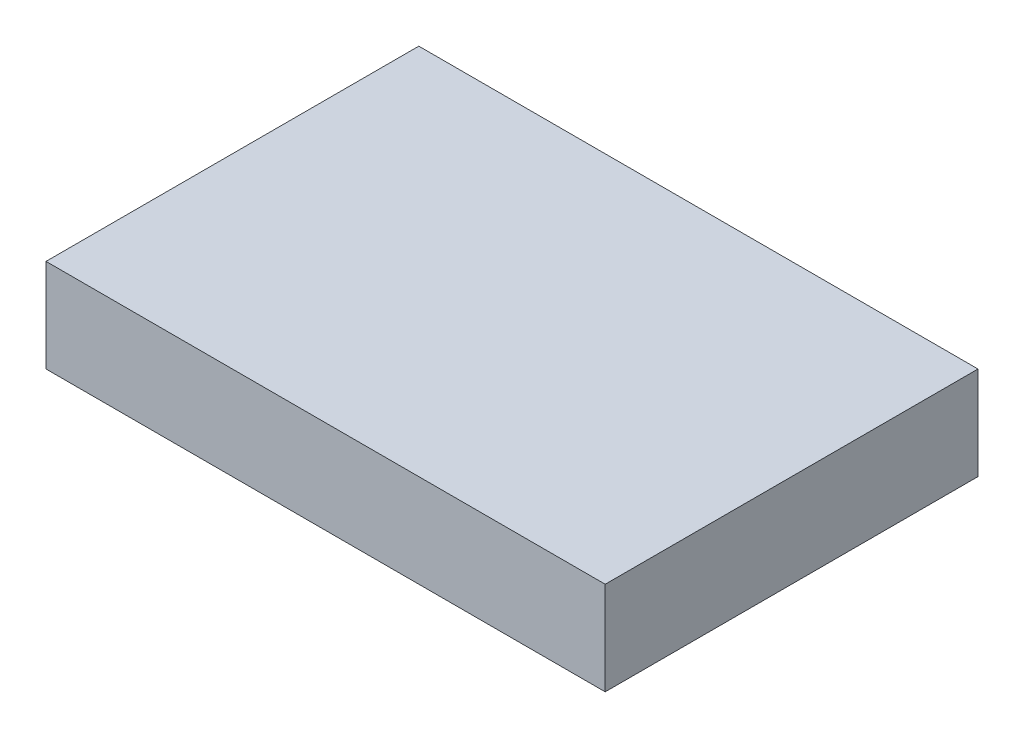
ISO-10303-21;
HEADER;
FILE_DESCRIPTION(('STEP AP214'),'2;1');
FILE_NAME('part.step','',(''),(''),'','','');
FILE_SCHEMA(('AUTOMOTIVE_DESIGN { 1 0 10303 214 1 1 1 1 }'));
ENDSEC;
DATA;
#1=APPLICATION_CONTEXT('core data for automotive mechanical design processes');
#2=APPLICATION_PROTOCOL_DEFINITION('international standard','automotive_design',2000,#1);
#3=PRODUCT_CONTEXT('',#1,'mechanical');
#4=PRODUCT('Part','Part','',(#3));
#5=PRODUCT_RELATED_PRODUCT_CATEGORY('part','',(#4));
#6=PRODUCT_DEFINITION_FORMATION('','',#4);
#7=PRODUCT_DEFINITION_CONTEXT('part definition',#1,'design');
#8=PRODUCT_DEFINITION('design','',#6,#7);
#9=PRODUCT_DEFINITION_SHAPE('','',#8);
#10=(LENGTH_UNIT() NAMED_UNIT(*) SI_UNIT(.MILLI.,.METRE.));
#11=(NAMED_UNIT(*) PLANE_ANGLE_UNIT() SI_UNIT($,.RADIAN.));
#12=(NAMED_UNIT(*) SI_UNIT($,.STERADIAN.) SOLID_ANGLE_UNIT());
#13=UNCERTAINTY_MEASURE_WITH_UNIT(LENGTH_MEASURE(1.E-05),#10,'distance_accuracy_value','');
#14=(GEOMETRIC_REPRESENTATION_CONTEXT(3) GLOBAL_UNCERTAINTY_ASSIGNED_CONTEXT((#13)) GLOBAL_UNIT_ASSIGNED_CONTEXT((#10,
#11,#12)) REPRESENTATION_CONTEXT('',''));
#15=CARTESIAN_POINT('',(0.,0.,0.));
#16=DIRECTION('',(0.,0.,1.));
#17=DIRECTION('',(1.,0.,0.));
#18=AXIS2_PLACEMENT_3D('',#15,#16,#17);
#19=CARTESIAN_POINT('',(15.,5.,9.99999999999999));
#20=DIRECTION('',(-1.,0.,0.));
#21=DIRECTION('',(0.,0.,1.));
#22=AXIS2_PLACEMENT_3D('',#19,#20,#21);
#23=PLANE('',#22);
#24=DIRECTION('',(0.,0.,-1.));
#25=VECTOR('',#24,1.);
#26=CARTESIAN_POINT('',(15.,0.,9.99999999999999));
#27=LINE('',#26,#25);
#28=CARTESIAN_POINT('',(15.,0.,9.99999999999999));
#29=VERTEX_POINT('',#28);
#30=CARTESIAN_POINT('',(15.,0.,-10.));
#31=VERTEX_POINT('',#30);
#32=EDGE_CURVE('E115',#29,#31,#27,.T.);
#33=ORIENTED_EDGE('',*,*,#32,.T.);
#34=DIRECTION('',(0.,-1.,0.));
#35=VECTOR('',#34,1.);
#36=CARTESIAN_POINT('',(15.,5.,-10.));
#37=LINE('',#36,#35);
#38=CARTESIAN_POINT('',(15.,5.,-10.));
#39=VERTEX_POINT('',#38);
#40=EDGE_CURVE('E11',#39,#31,#37,.T.);
#41=ORIENTED_EDGE('',*,*,#40,.F.);
#42=DIRECTION('',(0.,0.,-1.));
#43=VECTOR('',#42,1.);
#44=CARTESIAN_POINT('',(15.,5.,9.99999999999999));
#45=LINE('',#44,#43);
#46=CARTESIAN_POINT('',(15.,5.,9.99999999999999));
#47=VERTEX_POINT('',#46);
#48=EDGE_CURVE('E99',#47,#39,#45,.T.);
#49=ORIENTED_EDGE('',*,*,#48,.F.);
#50=DIRECTION('',(0.,-1.,0.));
#51=VECTOR('',#50,1.);
#52=CARTESIAN_POINT('',(15.,5.,9.99999999999999));
#53=LINE('',#52,#51);
#54=EDGE_CURVE('E111',#47,#29,#53,.T.);
#55=ORIENTED_EDGE('',*,*,#54,.T.);
#56=EDGE_LOOP('',(#33,#41,#49,#55));
#57=FACE_BOUND('',#56,.T.);
#58=ADVANCED_FACE('F47',(#57),#23,.F.);
#59=CARTESIAN_POINT('',(-15.,5.,-10.));
#60=DIRECTION('',(0.,0.,1.));
#61=DIRECTION('',(1.,0.,0.));
#62=AXIS2_PLACEMENT_3D('',#59,#60,#61);
#63=PLANE('',#62);
#64=DIRECTION('',(-1.,0.,0.));
#65=VECTOR('',#64,1.);
#66=CARTESIAN_POINT('',(-15.,0.,-10.));
#67=LINE('',#66,#65);
#68=CARTESIAN_POINT('',(-15.,0.,-10.));
#69=VERTEX_POINT('',#68);
#70=EDGE_CURVE('E104',#31,#69,#67,.T.);
#71=ORIENTED_EDGE('',*,*,#70,.T.);
#72=DIRECTION('',(0.,-1.,0.));
#73=VECTOR('',#72,1.);
#74=CARTESIAN_POINT('',(-15.,5.,-10.));
#75=LINE('',#74,#73);
#76=CARTESIAN_POINT('',(-15.,5.,-10.));
#77=VERTEX_POINT('',#76);
#78=EDGE_CURVE('E56',#77,#69,#75,.T.);
#79=ORIENTED_EDGE('',*,*,#78,.F.);
#80=DIRECTION('',(-1.,0.,0.));
#81=VECTOR('',#80,1.);
#82=CARTESIAN_POINT('',(-15.,5.,-10.));
#83=LINE('',#82,#81);
#84=EDGE_CURVE('E94',#39,#77,#83,.T.);
#85=ORIENTED_EDGE('',*,*,#84,.F.);
#86=ORIENTED_EDGE('',*,*,#40,.T.);
#87=EDGE_LOOP('',(#71,#79,#85,#86));
#88=FACE_BOUND('',#87,.T.);
#89=ADVANCED_FACE('F103',(#88),#63,.F.);
#90=CARTESIAN_POINT('',(-15.,5.,9.99999999999999));
#91=DIRECTION('',(1.,0.,0.));
#92=DIRECTION('',(0.,0.,-1.));
#93=AXIS2_PLACEMENT_3D('',#90,#91,#92);
#94=PLANE('',#93);
#95=DIRECTION('',(0.,0.,1.));
#96=VECTOR('',#95,1.);
#97=CARTESIAN_POINT('',(-15.,0.,9.99999999999999));
#98=LINE('',#97,#96);
#99=CARTESIAN_POINT('',(-15.,0.,9.99999999999999));
#100=VERTEX_POINT('',#99);
#101=EDGE_CURVE('E81',#69,#100,#98,.T.);
#102=ORIENTED_EDGE('',*,*,#101,.T.);
#103=DIRECTION('',(0.,-1.,0.));
#104=VECTOR('',#103,1.);
#105=CARTESIAN_POINT('',(-15.,5.,9.99999999999999));
#106=LINE('',#105,#104);
#107=CARTESIAN_POINT('',(-15.,5.,9.99999999999999));
#108=VERTEX_POINT('',#107);
#109=EDGE_CURVE('E106',#108,#100,#106,.T.);
#110=ORIENTED_EDGE('',*,*,#109,.F.);
#111=DIRECTION('',(0.,0.,1.));
#112=VECTOR('',#111,1.);
#113=CARTESIAN_POINT('',(-15.,5.,9.99999999999999));
#114=LINE('',#113,#112);
#115=EDGE_CURVE('E97',#77,#108,#114,.T.);
#116=ORIENTED_EDGE('',*,*,#115,.F.);
#117=ORIENTED_EDGE('',*,*,#78,.T.);
#118=EDGE_LOOP('',(#102,#110,#116,#117));
#119=FACE_BOUND('',#118,.T.);
#120=ADVANCED_FACE('F107',(#119),#94,.F.);
#121=CARTESIAN_POINT('',(-15.,5.,9.99999999999999));
#122=DIRECTION('',(0.,0.,-1.));
#123=DIRECTION('',(-1.,0.,0.));
#124=AXIS2_PLACEMENT_3D('',#121,#122,#123);
#125=PLANE('',#124);
#126=DIRECTION('',(1.,0.,0.));
#127=VECTOR('',#126,1.);
#128=CARTESIAN_POINT('',(-15.,0.,9.99999999999999));
#129=LINE('',#128,#127);
#130=EDGE_CURVE('E87',#100,#29,#129,.T.);
#131=ORIENTED_EDGE('',*,*,#130,.T.);
#132=ORIENTED_EDGE('',*,*,#54,.F.);
#133=DIRECTION('',(1.,0.,0.));
#134=VECTOR('',#133,1.);
#135=CARTESIAN_POINT('',(-15.,5.,9.99999999999999));
#136=LINE('',#135,#134);
#137=EDGE_CURVE('E64',#108,#47,#136,.T.);
#138=ORIENTED_EDGE('',*,*,#137,.F.);
#139=ORIENTED_EDGE('',*,*,#109,.T.);
#140=EDGE_LOOP('',(#131,#132,#138,#139));
#141=FACE_BOUND('',#140,.T.);
#142=ADVANCED_FACE('F129',(#141),#125,.F.);
#143=CARTESIAN_POINT('',(0.,5.,0.));
#144=DIRECTION('',(0.,-1.,0.));
#145=DIRECTION('',(0.,0.,-1.));
#146=AXIS2_PLACEMENT_3D('',#143,#144,#145);
#147=PLANE('',#146);
#148=ORIENTED_EDGE('',*,*,#48,.T.);
#149=ORIENTED_EDGE('',*,*,#84,.T.);
#150=ORIENTED_EDGE('',*,*,#115,.T.);
#151=ORIENTED_EDGE('',*,*,#137,.T.);
#152=EDGE_LOOP('',(#148,#149,#150,#151));
#153=FACE_BOUND('',#152,.T.);
#154=ADVANCED_FACE('F95',(#153),#147,.F.);
#155=CARTESIAN_POINT('',(0.,0.,0.));
#156=DIRECTION('',(0.,-1.,0.));
#157=DIRECTION('',(0.,0.,-1.));
#158=AXIS2_PLACEMENT_3D('',#155,#156,#157);
#159=PLANE('',#158);
#160=ORIENTED_EDGE('',*,*,#32,.F.);
#161=ORIENTED_EDGE('',*,*,#130,.F.);
#162=ORIENTED_EDGE('',*,*,#101,.F.);
#163=ORIENTED_EDGE('',*,*,#70,.F.);
#164=EDGE_LOOP('',(#160,#161,#162,#163));
#165=FACE_BOUND('',#164,.T.);
#166=ADVANCED_FACE('F132',(#165),#159,.T.);
#167=CLOSED_SHELL('',(#58,#89,#120,#142,#154,#166));
#168=MANIFOLD_SOLID_BREP('B2',#167);
#169=ADVANCED_BREP_SHAPE_REPRESENTATION('',(#18,#168),#14);
#170=SHAPE_DEFINITION_REPRESENTATION(#9,#169);
ENDSEC;
END-ISO-10303-21;
